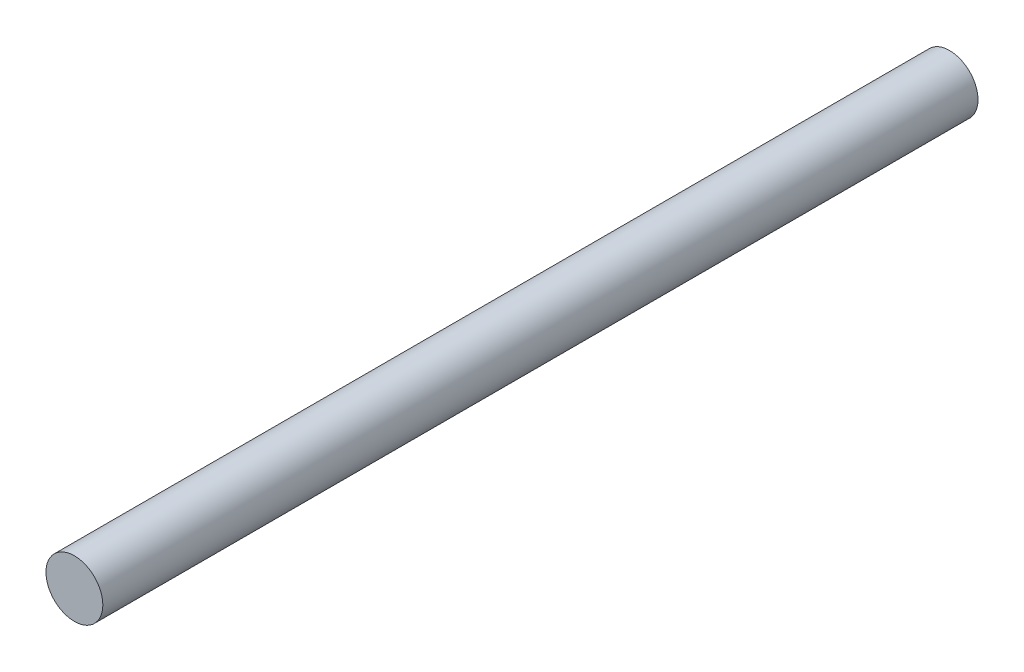
ISO-10303-21;
HEADER;
FILE_DESCRIPTION(('STEP AP214'),'2;1');
FILE_NAME('part.step','',(''),(''),'','','');
FILE_SCHEMA(('AUTOMOTIVE_DESIGN { 1 0 10303 214 1 1 1 1 }'));
ENDSEC;
DATA;
#1=APPLICATION_CONTEXT('core data for automotive mechanical design processes');
#2=APPLICATION_PROTOCOL_DEFINITION('international standard','automotive_design',2000,#1);
#3=PRODUCT_CONTEXT('',#1,'mechanical');
#4=PRODUCT('Part','Part','',(#3));
#5=PRODUCT_RELATED_PRODUCT_CATEGORY('part','',(#4));
#6=PRODUCT_DEFINITION_FORMATION('','',#4);
#7=PRODUCT_DEFINITION_CONTEXT('part definition',#1,'design');
#8=PRODUCT_DEFINITION('design','',#6,#7);
#9=PRODUCT_DEFINITION_SHAPE('','',#8);
#10=(LENGTH_UNIT() NAMED_UNIT(*) SI_UNIT(.MILLI.,.METRE.));
#11=(NAMED_UNIT(*) PLANE_ANGLE_UNIT() SI_UNIT($,.RADIAN.));
#12=(NAMED_UNIT(*) SI_UNIT($,.STERADIAN.) SOLID_ANGLE_UNIT());
#13=UNCERTAINTY_MEASURE_WITH_UNIT(LENGTH_MEASURE(1.E-05),#10,'distance_accuracy_value','');
#14=(GEOMETRIC_REPRESENTATION_CONTEXT(3) GLOBAL_UNCERTAINTY_ASSIGNED_CONTEXT((#13)) GLOBAL_UNIT_ASSIGNED_CONTEXT((#10,
#11,#12)) REPRESENTATION_CONTEXT('',''));
#15=CARTESIAN_POINT('',(0.,0.,0.));
#16=DIRECTION('',(0.,0.,1.));
#17=DIRECTION('',(1.,0.,0.));
#18=AXIS2_PLACEMENT_3D('',#15,#16,#17);
#19=CARTESIAN_POINT('',(0.,0.,400.));
#20=DIRECTION('',(0.,0.,-1.));
#21=DIRECTION('',(-1.,0.,0.));
#22=AXIS2_PLACEMENT_3D('',#19,#20,#21);
#23=CYLINDRICAL_SURFACE('',#22,13.);
#24=CARTESIAN_POINT('',(0.,0.,400.));
#25=DIRECTION('',(0.,0.,1.));
#26=DIRECTION('',(1.,0.,0.));
#27=AXIS2_PLACEMENT_3D('',#24,#25,#26);
#28=CIRCLE('',#27,13.);
#29=CARTESIAN_POINT('',(13.,0.,400.));
#30=VERTEX_POINT('',#29);
#31=EDGE_CURVE('E10',#30,#30,#28,.T.);
#32=ORIENTED_EDGE('',*,*,#31,.F.);
#33=EDGE_LOOP('',(#32));
#34=FACE_BOUND('',#33,.T.);
#35=CARTESIAN_POINT('',(0.,0.,0.));
#36=DIRECTION('',(0.,0.,1.));
#37=DIRECTION('',(1.,0.,0.));
#38=AXIS2_PLACEMENT_3D('',#35,#36,#37);
#39=CIRCLE('',#38,13.);
#40=CARTESIAN_POINT('',(13.,0.,0.));
#41=VERTEX_POINT('',#40);
#42=EDGE_CURVE('E34',#41,#41,#39,.T.);
#43=ORIENTED_EDGE('',*,*,#42,.T.);
#44=EDGE_LOOP('',(#43));
#45=FACE_BOUND('',#44,.T.);
#46=ADVANCED_FACE('F31',(#34,#45),#23,.T.);
#47=CARTESIAN_POINT('',(0.,0.,400.));
#48=DIRECTION('',(0.,0.,1.));
#49=DIRECTION('',(1.,0.,0.));
#50=AXIS2_PLACEMENT_3D('',#47,#48,#49);
#51=PLANE('',#50);
#52=ORIENTED_EDGE('',*,*,#31,.T.);
#53=EDGE_LOOP('',(#52));
#54=FACE_BOUND('',#53,.T.);
#55=ADVANCED_FACE('F46',(#54),#51,.T.);
#56=CARTESIAN_POINT('',(0.,0.,0.));
#57=DIRECTION('',(0.,0.,1.));
#58=DIRECTION('',(1.,0.,0.));
#59=AXIS2_PLACEMENT_3D('',#56,#57,#58);
#60=PLANE('',#59);
#61=ORIENTED_EDGE('',*,*,#42,.F.);
#62=EDGE_LOOP('',(#61));
#63=FACE_BOUND('',#62,.T.);
#64=ADVANCED_FACE('F44',(#63),#60,.F.);
#65=CLOSED_SHELL('',(#46,#55,#64));
#66=MANIFOLD_SOLID_BREP('B2',#65);
#67=ADVANCED_BREP_SHAPE_REPRESENTATION('',(#18,#66),#14);
#68=SHAPE_DEFINITION_REPRESENTATION(#9,#67);
ENDSEC;
END-ISO-10303-21;
